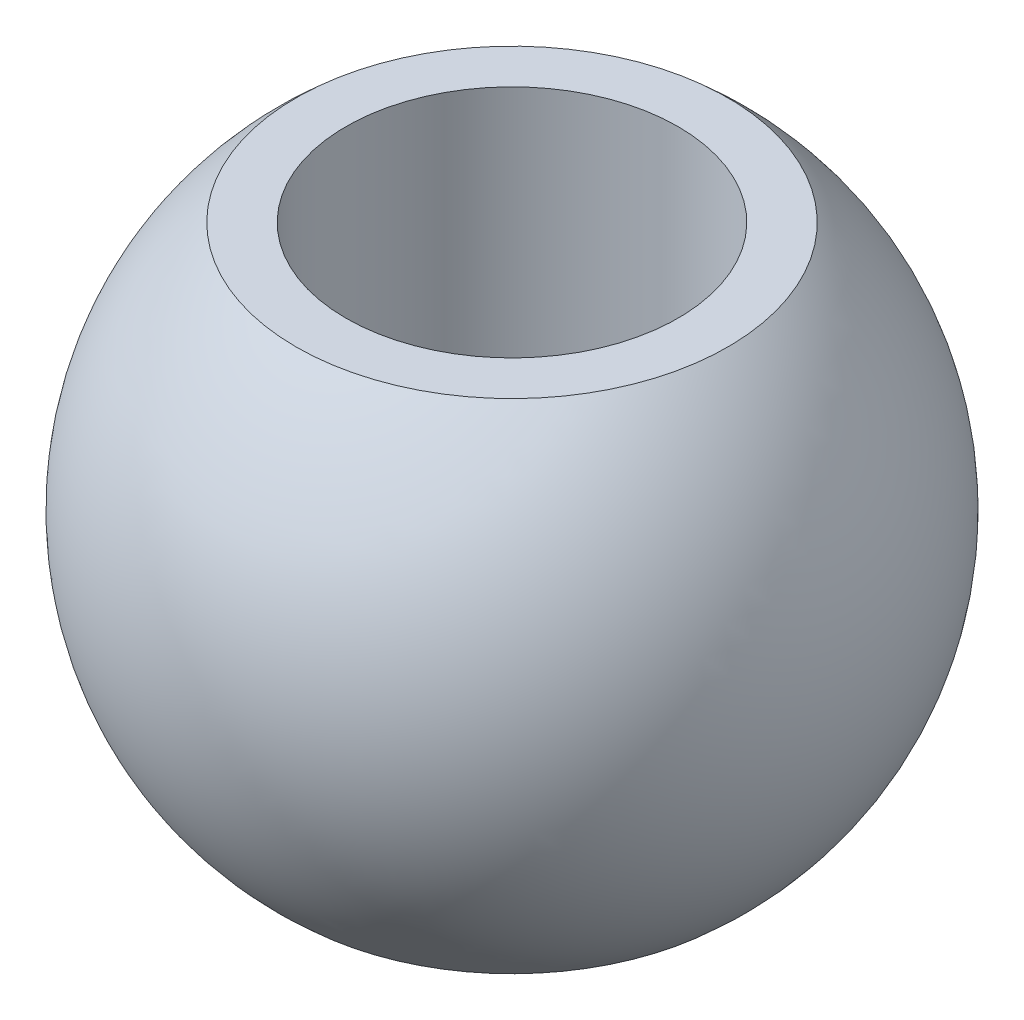
ISO-10303-21;
HEADER;
FILE_DESCRIPTION(('STEP AP214'),'2;1');
FILE_NAME('part.step','',(''),(''),'','','');
FILE_SCHEMA(('AUTOMOTIVE_DESIGN { 1 0 10303 214 1 1 1 1 }'));
ENDSEC;
DATA;
#1=APPLICATION_CONTEXT('core data for automotive mechanical design processes');
#2=APPLICATION_PROTOCOL_DEFINITION('international standard','automotive_design',2000,#1);
#3=PRODUCT_CONTEXT('',#1,'mechanical');
#4=PRODUCT('Part','Part','',(#3));
#5=PRODUCT_RELATED_PRODUCT_CATEGORY('part','',(#4));
#6=PRODUCT_DEFINITION_FORMATION('','',#4);
#7=PRODUCT_DEFINITION_CONTEXT('part definition',#1,'design');
#8=PRODUCT_DEFINITION('design','',#6,#7);
#9=PRODUCT_DEFINITION_SHAPE('','',#8);
#10=(LENGTH_UNIT() NAMED_UNIT(*) SI_UNIT(.MILLI.,.METRE.));
#11=(NAMED_UNIT(*) PLANE_ANGLE_UNIT() SI_UNIT($,.RADIAN.));
#12=(NAMED_UNIT(*) SI_UNIT($,.STERADIAN.) SOLID_ANGLE_UNIT());
#13=UNCERTAINTY_MEASURE_WITH_UNIT(LENGTH_MEASURE(1.E-05),#10,'distance_accuracy_value','');
#14=(GEOMETRIC_REPRESENTATION_CONTEXT(3) GLOBAL_UNCERTAINTY_ASSIGNED_CONTEXT((#13)) GLOBAL_UNIT_ASSIGNED_CONTEXT((#10,
#11,#12)) REPRESENTATION_CONTEXT('',''));
#15=CARTESIAN_POINT('',(0.,0.,0.));
#16=DIRECTION('',(0.,0.,1.));
#17=DIRECTION('',(1.,0.,0.));
#18=AXIS2_PLACEMENT_3D('',#15,#16,#17);
#19=CARTESIAN_POINT('',(0.,6.,0.));
#20=DIRECTION('',(0.,1.,0.));
#21=DIRECTION('',(0.,0.,1.));
#22=AXIS2_PLACEMENT_3D('',#19,#20,#21);
#23=DEGENERATE_TOROIDAL_SURFACE('',#22,0.00347171180604521,7.9375,.T.);
#24=CARTESIAN_POINT('',(0.,0.,0.));
#25=DIRECTION('',(0.,1.,0.));
#26=DIRECTION('',(0.,0.,1.));
#27=AXIS2_PLACEMENT_3D('',#24,#25,#26);
#28=CIRCLE('',#27,5.2);
#29=CARTESIAN_POINT('',(0.,0.,5.2));
#30=VERTEX_POINT('',#29);
#31=EDGE_CURVE('E10',#30,#30,#28,.T.);
#32=ORIENTED_EDGE('',*,*,#31,.T.);
#33=EDGE_LOOP('',(#32));
#34=FACE_BOUND('',#33,.T.);
#35=CARTESIAN_POINT('',(0.,12.,0.));
#36=DIRECTION('',(0.,1.,0.));
#37=DIRECTION('',(0.,0.,1.));
#38=AXIS2_PLACEMENT_3D('',#35,#36,#37);
#39=CIRCLE('',#38,5.2);
#40=CARTESIAN_POINT('',(0.,12.,5.2));
#41=VERTEX_POINT('',#40);
#42=EDGE_CURVE('E46',#41,#41,#39,.T.);
#43=ORIENTED_EDGE('',*,*,#42,.F.);
#44=EDGE_LOOP('',(#43));
#45=FACE_BOUND('',#44,.T.);
#46=ADVANCED_FACE('F32',(#34,#45),#23,.T.);
#47=CARTESIAN_POINT('',(-4.,0.,0.));
#48=DIRECTION('',(0.,-1.,0.));
#49=DIRECTION('',(0.,0.,-1.));
#50=AXIS2_PLACEMENT_3D('',#47,#48,#49);
#51=PLANE('',#50);
#52=CARTESIAN_POINT('',(0.,0.,0.));
#53=DIRECTION('',(0.,1.,0.));
#54=DIRECTION('',(0.,0.,1.));
#55=AXIS2_PLACEMENT_3D('',#52,#53,#54);
#56=CIRCLE('',#55,4.);
#57=CARTESIAN_POINT('',(0.,0.,4.));
#58=VERTEX_POINT('',#57);
#59=EDGE_CURVE('E38',#58,#58,#56,.T.);
#60=ORIENTED_EDGE('',*,*,#59,.T.);
#61=EDGE_LOOP('',(#60));
#62=FACE_BOUND('',#61,.T.);
#63=ORIENTED_EDGE('',*,*,#31,.F.);
#64=EDGE_LOOP('',(#63));
#65=FACE_BOUND('',#64,.T.);
#66=ADVANCED_FACE('F56',(#62,#65),#51,.T.);
#67=CARTESIAN_POINT('',(0.,12.,0.));
#68=DIRECTION('',(0.,1.,0.));
#69=DIRECTION('',(0.,0.,1.));
#70=AXIS2_PLACEMENT_3D('',#67,#68,#69);
#71=CYLINDRICAL_SURFACE('',#70,4.);
#72=CARTESIAN_POINT('',(0.,12.,0.));
#73=DIRECTION('',(0.,1.,0.));
#74=DIRECTION('',(0.,0.,1.));
#75=AXIS2_PLACEMENT_3D('',#72,#73,#74);
#76=CIRCLE('',#75,4.);
#77=CARTESIAN_POINT('',(0.,12.,4.));
#78=VERTEX_POINT('',#77);
#79=EDGE_CURVE('E42',#78,#78,#76,.T.);
#80=ORIENTED_EDGE('',*,*,#79,.T.);
#81=EDGE_LOOP('',(#80));
#82=FACE_BOUND('',#81,.T.);
#83=ORIENTED_EDGE('',*,*,#59,.F.);
#84=EDGE_LOOP('',(#83));
#85=FACE_BOUND('',#84,.T.);
#86=ADVANCED_FACE('F60',(#82,#85),#71,.F.);
#87=CARTESIAN_POINT('',(-5.2,12.,0.));
#88=DIRECTION('',(0.,1.,0.));
#89=DIRECTION('',(0.,0.,1.));
#90=AXIS2_PLACEMENT_3D('',#87,#88,#89);
#91=PLANE('',#90);
#92=ORIENTED_EDGE('',*,*,#42,.T.);
#93=EDGE_LOOP('',(#92));
#94=FACE_BOUND('',#93,.T.);
#95=ORIENTED_EDGE('',*,*,#79,.F.);
#96=EDGE_LOOP('',(#95));
#97=FACE_BOUND('',#96,.T.);
#98=ADVANCED_FACE('F52',(#94,#97),#91,.T.);
#99=CLOSED_SHELL('',(#46,#66,#86,#98));
#100=MANIFOLD_SOLID_BREP('B2',#99);
#101=ADVANCED_BREP_SHAPE_REPRESENTATION('',(#18,#100),#14);
#102=SHAPE_DEFINITION_REPRESENTATION(#9,#101);
ENDSEC;
END-ISO-10303-21;
